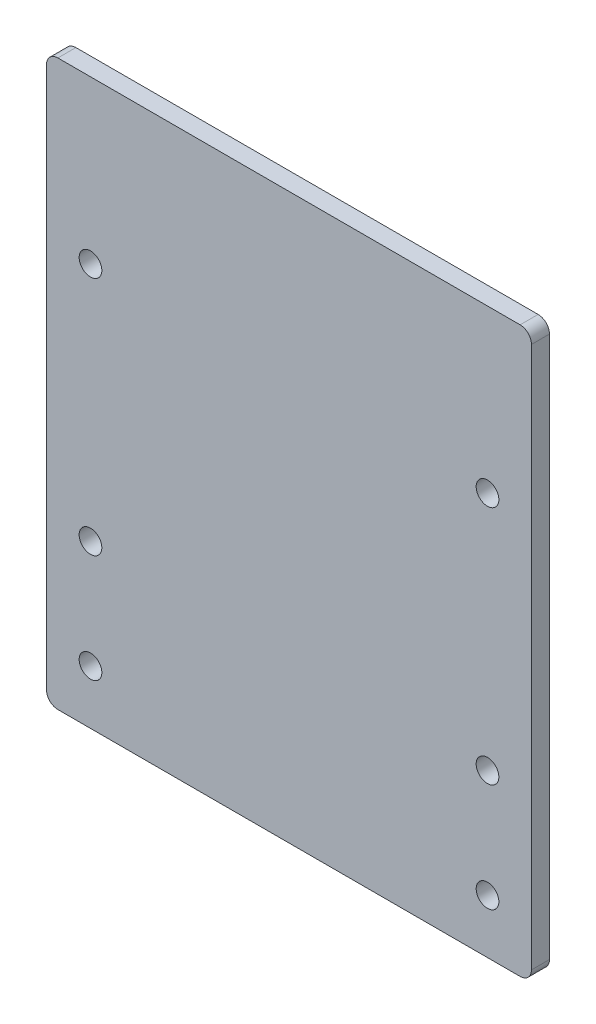
ISO-10303-21;
HEADER;
FILE_DESCRIPTION(('STEP AP214'),'2;1');
FILE_NAME('part.step','',(''),(''),'','','');
FILE_SCHEMA(('AUTOMOTIVE_DESIGN { 1 0 10303 214 1 1 1 1 }'));
ENDSEC;
DATA;
#1=APPLICATION_CONTEXT('core data for automotive mechanical design processes');
#2=APPLICATION_PROTOCOL_DEFINITION('international standard','automotive_design',2000,#1);
#3=PRODUCT_CONTEXT('',#1,'mechanical');
#4=PRODUCT('Part','Part','',(#3));
#5=PRODUCT_RELATED_PRODUCT_CATEGORY('part','',(#4));
#6=PRODUCT_DEFINITION_FORMATION('','',#4);
#7=PRODUCT_DEFINITION_CONTEXT('part definition',#1,'design');
#8=PRODUCT_DEFINITION('design','',#6,#7);
#9=PRODUCT_DEFINITION_SHAPE('','',#8);
#10=(LENGTH_UNIT() NAMED_UNIT(*) SI_UNIT(.MILLI.,.METRE.));
#11=(NAMED_UNIT(*) PLANE_ANGLE_UNIT() SI_UNIT($,.RADIAN.));
#12=(NAMED_UNIT(*) SI_UNIT($,.STERADIAN.) SOLID_ANGLE_UNIT());
#13=UNCERTAINTY_MEASURE_WITH_UNIT(LENGTH_MEASURE(1.E-05),#10,'distance_accuracy_value','');
#14=(GEOMETRIC_REPRESENTATION_CONTEXT(3) GLOBAL_UNCERTAINTY_ASSIGNED_CONTEXT((#13)) GLOBAL_UNIT_ASSIGNED_CONTEXT((#10,
#11,#12)) REPRESENTATION_CONTEXT('',''));
#15=CARTESIAN_POINT('',(0.,0.,0.));
#16=DIRECTION('',(0.,0.,1.));
#17=DIRECTION('',(1.,0.,0.));
#18=AXIS2_PLACEMENT_3D('',#15,#16,#17);
#19=CARTESIAN_POINT('',(40.75,-97.5,3.175));
#20=DIRECTION('',(0.,0.,1.));
#21=DIRECTION('',(1.,0.,0.));
#22=AXIS2_PLACEMENT_3D('',#19,#20,#21);
#23=PLANE('',#22);
#24=CARTESIAN_POINT('',(-35.,-70.92,3.175));
#25=DIRECTION('',(0.,0.,1.));
#26=DIRECTION('',(1.,0.,0.));
#27=AXIS2_PLACEMENT_3D('',#24,#25,#26);
#28=CIRCLE('',#27,2.);
#29=CARTESIAN_POINT('',(-33.,-70.92,3.175));
#30=VERTEX_POINT('',#29);
#31=EDGE_CURVE('E200',#30,#30,#28,.T.);
#32=ORIENTED_EDGE('',*,*,#31,.F.);
#33=EDGE_LOOP('',(#32));
#34=FACE_BOUND('',#33,.T.);
#35=CARTESIAN_POINT('',(35.,-70.925,3.175));
#36=DIRECTION('',(0.,0.,1.));
#37=DIRECTION('',(1.,0.,0.));
#38=AXIS2_PLACEMENT_3D('',#35,#36,#37);
#39=CIRCLE('',#38,2.);
#40=CARTESIAN_POINT('',(37.,-70.925,3.175));
#41=VERTEX_POINT('',#40);
#42=EDGE_CURVE('E188',#41,#41,#39,.T.);
#43=ORIENTED_EDGE('',*,*,#42,.F.);
#44=EDGE_LOOP('',(#43));
#45=FACE_BOUND('',#44,.T.);
#46=CARTESIAN_POINT('',(35.,-89.975,3.175));
#47=DIRECTION('',(0.,0.,1.));
#48=DIRECTION('',(1.,0.,0.));
#49=AXIS2_PLACEMENT_3D('',#46,#47,#48);
#50=CIRCLE('',#49,2.);
#51=CARTESIAN_POINT('',(37.,-89.975,3.175));
#52=VERTEX_POINT('',#51);
#53=EDGE_CURVE('E134',#52,#52,#50,.T.);
#54=ORIENTED_EDGE('',*,*,#53,.F.);
#55=EDGE_LOOP('',(#54));
#56=FACE_BOUND('',#55,.T.);
#57=CARTESIAN_POINT('',(40.75,-97.5,3.175));
#58=DIRECTION('',(0.,0.,1.));
#59=DIRECTION('',(1.,0.,0.));
#60=AXIS2_PLACEMENT_3D('',#57,#58,#59);
#61=CIRCLE('',#60,1.99999999999999);
#62=CARTESIAN_POINT('',(40.75,-99.5,3.175));
#63=VERTEX_POINT('',#62);
#64=CARTESIAN_POINT('',(42.75,-97.5,3.175));
#65=VERTEX_POINT('',#64);
#66=EDGE_CURVE('E145',#63,#65,#61,.T.);
#67=ORIENTED_EDGE('',*,*,#66,.T.);
#68=DIRECTION('',(0.,1.,0.));
#69=VECTOR('',#68,1.);
#70=CARTESIAN_POINT('',(42.75,-2.,3.175));
#71=LINE('',#70,#69);
#72=CARTESIAN_POINT('',(42.75,-2.,3.175));
#73=VERTEX_POINT('',#72);
#74=EDGE_CURVE('E93',#65,#73,#71,.T.);
#75=ORIENTED_EDGE('',*,*,#74,.T.);
#76=CARTESIAN_POINT('',(40.75,-2.,3.175));
#77=DIRECTION('',(0.,0.,1.));
#78=DIRECTION('',(-1.,0.,0.));
#79=AXIS2_PLACEMENT_3D('',#76,#77,#78);
#80=CIRCLE('',#79,2.);
#81=CARTESIAN_POINT('',(40.75,0.,3.175));
#82=VERTEX_POINT('',#81);
#83=EDGE_CURVE('E160',#73,#82,#80,.T.);
#84=ORIENTED_EDGE('',*,*,#83,.T.);
#85=DIRECTION('',(-1.,0.,0.));
#86=VECTOR('',#85,1.);
#87=CARTESIAN_POINT('',(-40.75,0.,3.175));
#88=LINE('',#87,#86);
#89=CARTESIAN_POINT('',(-40.75,0.,3.175));
#90=VERTEX_POINT('',#89);
#91=EDGE_CURVE('E173',#82,#90,#88,.T.);
#92=ORIENTED_EDGE('',*,*,#91,.T.);
#93=CARTESIAN_POINT('',(-40.75,-2.,3.175));
#94=DIRECTION('',(0.,0.,1.));
#95=DIRECTION('',(1.,0.,0.));
#96=AXIS2_PLACEMENT_3D('',#93,#94,#95);
#97=CIRCLE('',#96,2.);
#98=CARTESIAN_POINT('',(-42.75,-2.,3.175));
#99=VERTEX_POINT('',#98);
#100=EDGE_CURVE('E112',#90,#99,#97,.T.);
#101=ORIENTED_EDGE('',*,*,#100,.T.);
#102=DIRECTION('',(0.,-1.,0.));
#103=VECTOR('',#102,1.);
#104=CARTESIAN_POINT('',(-42.75,-2.,3.175));
#105=LINE('',#104,#103);
#106=CARTESIAN_POINT('',(-42.75,-97.5,3.175));
#107=VERTEX_POINT('',#106);
#108=EDGE_CURVE('E106',#99,#107,#105,.T.);
#109=ORIENTED_EDGE('',*,*,#108,.T.);
#110=CARTESIAN_POINT('',(-40.75,-97.5,3.175));
#111=DIRECTION('',(0.,0.,1.));
#112=DIRECTION('',(1.,0.,0.));
#113=AXIS2_PLACEMENT_3D('',#110,#111,#112);
#114=CIRCLE('',#113,1.99999999999999);
#115=CARTESIAN_POINT('',(-40.75,-99.5,3.175));
#116=VERTEX_POINT('',#115);
#117=EDGE_CURVE('E110',#107,#116,#114,.T.);
#118=ORIENTED_EDGE('',*,*,#117,.T.);
#119=DIRECTION('',(1.,0.,0.));
#120=VECTOR('',#119,1.);
#121=CARTESIAN_POINT('',(-40.75,-99.5,3.175));
#122=LINE('',#121,#120);
#123=EDGE_CURVE('E50',#116,#63,#122,.T.);
#124=ORIENTED_EDGE('',*,*,#123,.T.);
#125=EDGE_LOOP('',(#67,#75,#84,#92,#101,#109,#118,#124));
#126=FACE_BOUND('',#125,.T.);
#127=CARTESIAN_POINT('',(-35.,-89.975,3.175));
#128=DIRECTION('',(0.,0.,1.));
#129=DIRECTION('',(1.,0.,0.));
#130=AXIS2_PLACEMENT_3D('',#127,#128,#129);
#131=CIRCLE('',#130,2.);
#132=CARTESIAN_POINT('',(-33.,-89.975,3.175));
#133=VERTEX_POINT('',#132);
#134=EDGE_CURVE('E182',#133,#133,#131,.T.);
#135=ORIENTED_EDGE('',*,*,#134,.F.);
#136=EDGE_LOOP('',(#135));
#137=FACE_BOUND('',#136,.T.);
#138=CARTESIAN_POINT('',(35.,-28.58,3.175));
#139=DIRECTION('',(0.,0.,1.));
#140=DIRECTION('',(1.,0.,0.));
#141=AXIS2_PLACEMENT_3D('',#138,#139,#140);
#142=CIRCLE('',#141,2.);
#143=CARTESIAN_POINT('',(37.,-28.58,3.175));
#144=VERTEX_POINT('',#143);
#145=EDGE_CURVE('E194',#144,#144,#142,.T.);
#146=ORIENTED_EDGE('',*,*,#145,.F.);
#147=EDGE_LOOP('',(#146));
#148=FACE_BOUND('',#147,.T.);
#149=CARTESIAN_POINT('',(-35.,-28.58,3.175));
#150=DIRECTION('',(0.,0.,1.));
#151=DIRECTION('',(1.,0.,0.));
#152=AXIS2_PLACEMENT_3D('',#149,#150,#151);
#153=CIRCLE('',#152,2.);
#154=CARTESIAN_POINT('',(-33.,-28.58,3.175));
#155=VERTEX_POINT('',#154);
#156=EDGE_CURVE('E206',#155,#155,#153,.T.);
#157=ORIENTED_EDGE('',*,*,#156,.F.);
#158=EDGE_LOOP('',(#157));
#159=FACE_BOUND('',#158,.T.);
#160=ADVANCED_FACE('F33',(#34,#45,#56,#126,#137,#148,#159),#23,.T.);
#161=CARTESIAN_POINT('',(40.75,-97.5,0.));
#162=DIRECTION('',(0.,0.,1.));
#163=DIRECTION('',(1.,0.,0.));
#164=AXIS2_PLACEMENT_3D('',#161,#162,#163);
#165=PLANE('',#164);
#166=CARTESIAN_POINT('',(40.75,-97.5,0.));
#167=DIRECTION('',(0.,0.,1.));
#168=DIRECTION('',(1.,0.,0.));
#169=AXIS2_PLACEMENT_3D('',#166,#167,#168);
#170=CIRCLE('',#169,1.99999999999999);
#171=CARTESIAN_POINT('',(40.75,-99.5,0.));
#172=VERTEX_POINT('',#171);
#173=CARTESIAN_POINT('',(42.75,-97.5,0.));
#174=VERTEX_POINT('',#173);
#175=EDGE_CURVE('E130',#172,#174,#170,.T.);
#176=ORIENTED_EDGE('',*,*,#175,.F.);
#177=DIRECTION('',(1.,0.,0.));
#178=VECTOR('',#177,1.);
#179=CARTESIAN_POINT('',(-40.75,-99.5,0.));
#180=LINE('',#179,#178);
#181=CARTESIAN_POINT('',(-40.75,-99.5,0.));
#182=VERTEX_POINT('',#181);
#183=EDGE_CURVE('E85',#182,#172,#180,.T.);
#184=ORIENTED_EDGE('',*,*,#183,.F.);
#185=CARTESIAN_POINT('',(-40.75,-97.5,0.));
#186=DIRECTION('',(0.,0.,1.));
#187=DIRECTION('',(1.,0.,0.));
#188=AXIS2_PLACEMENT_3D('',#185,#186,#187);
#189=CIRCLE('',#188,1.99999999999999);
#190=CARTESIAN_POINT('',(-42.75,-97.5,0.));
#191=VERTEX_POINT('',#190);
#192=EDGE_CURVE('E79',#191,#182,#189,.T.);
#193=ORIENTED_EDGE('',*,*,#192,.F.);
#194=DIRECTION('',(0.,-1.,0.));
#195=VECTOR('',#194,1.);
#196=CARTESIAN_POINT('',(-42.75,-2.,0.));
#197=LINE('',#196,#195);
#198=CARTESIAN_POINT('',(-42.75,-2.,0.));
#199=VERTEX_POINT('',#198);
#200=EDGE_CURVE('E120',#199,#191,#197,.T.);
#201=ORIENTED_EDGE('',*,*,#200,.F.);
#202=CARTESIAN_POINT('',(-40.75,-2.,0.));
#203=DIRECTION('',(0.,0.,1.));
#204=DIRECTION('',(1.,0.,0.));
#205=AXIS2_PLACEMENT_3D('',#202,#203,#204);
#206=CIRCLE('',#205,2.);
#207=CARTESIAN_POINT('',(-40.75,0.,0.));
#208=VERTEX_POINT('',#207);
#209=EDGE_CURVE('E140',#208,#199,#206,.T.);
#210=ORIENTED_EDGE('',*,*,#209,.F.);
#211=DIRECTION('',(-1.,0.,0.));
#212=VECTOR('',#211,1.);
#213=CARTESIAN_POINT('',(-40.75,0.,0.));
#214=LINE('',#213,#212);
#215=CARTESIAN_POINT('',(40.75,0.,0.));
#216=VERTEX_POINT('',#215);
#217=EDGE_CURVE('E138',#216,#208,#214,.T.);
#218=ORIENTED_EDGE('',*,*,#217,.F.);
#219=CARTESIAN_POINT('',(40.75,-2.,0.));
#220=DIRECTION('',(0.,0.,1.));
#221=DIRECTION('',(-1.,0.,0.));
#222=AXIS2_PLACEMENT_3D('',#219,#220,#221);
#223=CIRCLE('',#222,2.);
#224=CARTESIAN_POINT('',(42.75,-2.,0.));
#225=VERTEX_POINT('',#224);
#226=EDGE_CURVE('E136',#225,#216,#223,.T.);
#227=ORIENTED_EDGE('',*,*,#226,.F.);
#228=DIRECTION('',(0.,1.,0.));
#229=VECTOR('',#228,1.);
#230=CARTESIAN_POINT('',(42.75,-2.,0.));
#231=LINE('',#230,#229);
#232=EDGE_CURVE('E133',#174,#225,#231,.T.);
#233=ORIENTED_EDGE('',*,*,#232,.F.);
#234=EDGE_LOOP('',(#176,#184,#193,#201,#210,#218,#227,#233));
#235=FACE_BOUND('',#234,.T.);
#236=CARTESIAN_POINT('',(35.,-89.975,0.));
#237=DIRECTION('',(0.,0.,1.));
#238=DIRECTION('',(1.,0.,0.));
#239=AXIS2_PLACEMENT_3D('',#236,#237,#238);
#240=CIRCLE('',#239,2.);
#241=CARTESIAN_POINT('',(37.,-89.975,0.));
#242=VERTEX_POINT('',#241);
#243=EDGE_CURVE('E179',#242,#242,#240,.T.);
#244=ORIENTED_EDGE('',*,*,#243,.T.);
#245=EDGE_LOOP('',(#244));
#246=FACE_BOUND('',#245,.T.);
#247=CARTESIAN_POINT('',(-35.,-89.975,0.));
#248=DIRECTION('',(0.,0.,1.));
#249=DIRECTION('',(1.,0.,0.));
#250=AXIS2_PLACEMENT_3D('',#247,#248,#249);
#251=CIRCLE('',#250,2.);
#252=CARTESIAN_POINT('',(-33.,-89.975,0.));
#253=VERTEX_POINT('',#252);
#254=EDGE_CURVE('E185',#253,#253,#251,.T.);
#255=ORIENTED_EDGE('',*,*,#254,.T.);
#256=EDGE_LOOP('',(#255));
#257=FACE_BOUND('',#256,.T.);
#258=CARTESIAN_POINT('',(35.,-70.925,0.));
#259=DIRECTION('',(0.,0.,1.));
#260=DIRECTION('',(1.,0.,0.));
#261=AXIS2_PLACEMENT_3D('',#258,#259,#260);
#262=CIRCLE('',#261,2.);
#263=CARTESIAN_POINT('',(37.,-70.925,0.));
#264=VERTEX_POINT('',#263);
#265=EDGE_CURVE('E191',#264,#264,#262,.T.);
#266=ORIENTED_EDGE('',*,*,#265,.T.);
#267=EDGE_LOOP('',(#266));
#268=FACE_BOUND('',#267,.T.);
#269=CARTESIAN_POINT('',(35.,-28.58,0.));
#270=DIRECTION('',(0.,0.,1.));
#271=DIRECTION('',(1.,0.,0.));
#272=AXIS2_PLACEMENT_3D('',#269,#270,#271);
#273=CIRCLE('',#272,2.);
#274=CARTESIAN_POINT('',(37.,-28.58,0.));
#275=VERTEX_POINT('',#274);
#276=EDGE_CURVE('E197',#275,#275,#273,.T.);
#277=ORIENTED_EDGE('',*,*,#276,.T.);
#278=EDGE_LOOP('',(#277));
#279=FACE_BOUND('',#278,.T.);
#280=CARTESIAN_POINT('',(-35.,-70.92,0.));
#281=DIRECTION('',(0.,0.,1.));
#282=DIRECTION('',(1.,0.,0.));
#283=AXIS2_PLACEMENT_3D('',#280,#281,#282);
#284=CIRCLE('',#283,2.);
#285=CARTESIAN_POINT('',(-33.,-70.92,0.));
#286=VERTEX_POINT('',#285);
#287=EDGE_CURVE('E203',#286,#286,#284,.T.);
#288=ORIENTED_EDGE('',*,*,#287,.T.);
#289=EDGE_LOOP('',(#288));
#290=FACE_BOUND('',#289,.T.);
#291=CARTESIAN_POINT('',(-35.,-28.58,0.));
#292=DIRECTION('',(0.,0.,1.));
#293=DIRECTION('',(1.,0.,0.));
#294=AXIS2_PLACEMENT_3D('',#291,#292,#293);
#295=CIRCLE('',#294,2.);
#296=CARTESIAN_POINT('',(-33.,-28.58,0.));
#297=VERTEX_POINT('',#296);
#298=EDGE_CURVE('E209',#297,#297,#295,.T.);
#299=ORIENTED_EDGE('',*,*,#298,.T.);
#300=EDGE_LOOP('',(#299));
#301=FACE_BOUND('',#300,.T.);
#302=ADVANCED_FACE('F164',(#235,#246,#257,#268,#279,#290,#301),#165,.F.);
#303=CARTESIAN_POINT('',(40.75,-97.5,3.175));
#304=DIRECTION('',(0.,0.,-1.));
#305=DIRECTION('',(-1.,0.,0.));
#306=AXIS2_PLACEMENT_3D('',#303,#304,#305);
#307=CYLINDRICAL_SURFACE('',#306,1.99999999999999);
#308=ORIENTED_EDGE('',*,*,#175,.T.);
#309=DIRECTION('',(0.,0.,-1.));
#310=VECTOR('',#309,1.);
#311=CARTESIAN_POINT('',(42.75,-97.5,3.175));
#312=LINE('',#311,#310);
#313=EDGE_CURVE('E11',#65,#174,#312,.T.);
#314=ORIENTED_EDGE('',*,*,#313,.F.);
#315=ORIENTED_EDGE('',*,*,#66,.F.);
#316=DIRECTION('',(0.,0.,-1.));
#317=VECTOR('',#316,1.);
#318=CARTESIAN_POINT('',(40.75,-99.5,3.175));
#319=LINE('',#318,#317);
#320=EDGE_CURVE('E126',#63,#172,#319,.T.);
#321=ORIENTED_EDGE('',*,*,#320,.T.);
#322=EDGE_LOOP('',(#308,#314,#315,#321));
#323=FACE_BOUND('',#322,.T.);
#324=ADVANCED_FACE('F35',(#323),#307,.T.);
#325=CARTESIAN_POINT('',(42.75,-2.,3.175));
#326=DIRECTION('',(-1.,0.,0.));
#327=DIRECTION('',(0.,-1.,0.));
#328=AXIS2_PLACEMENT_3D('',#325,#326,#327);
#329=PLANE('',#328);
#330=ORIENTED_EDGE('',*,*,#232,.T.);
#331=DIRECTION('',(0.,0.,-1.));
#332=VECTOR('',#331,1.);
#333=CARTESIAN_POINT('',(42.75,-2.,3.175));
#334=LINE('',#333,#332);
#335=EDGE_CURVE('E42',#73,#225,#334,.T.);
#336=ORIENTED_EDGE('',*,*,#335,.F.);
#337=ORIENTED_EDGE('',*,*,#74,.F.);
#338=ORIENTED_EDGE('',*,*,#313,.T.);
#339=EDGE_LOOP('',(#330,#336,#337,#338));
#340=FACE_BOUND('',#339,.T.);
#341=ADVANCED_FACE('F243',(#340),#329,.F.);
#342=CARTESIAN_POINT('',(40.75,-2.,3.175));
#343=DIRECTION('',(0.,0.,-1.));
#344=DIRECTION('',(-1.,0.,0.));
#345=AXIS2_PLACEMENT_3D('',#342,#343,#344);
#346=CYLINDRICAL_SURFACE('',#345,2.);
#347=ORIENTED_EDGE('',*,*,#226,.T.);
#348=DIRECTION('',(0.,0.,-1.));
#349=VECTOR('',#348,1.);
#350=CARTESIAN_POINT('',(40.75,0.,3.175));
#351=LINE('',#350,#349);
#352=EDGE_CURVE('E152',#82,#216,#351,.T.);
#353=ORIENTED_EDGE('',*,*,#352,.F.);
#354=ORIENTED_EDGE('',*,*,#83,.F.);
#355=ORIENTED_EDGE('',*,*,#335,.T.);
#356=EDGE_LOOP('',(#347,#353,#354,#355));
#357=FACE_BOUND('',#356,.T.);
#358=ADVANCED_FACE('F158',(#357),#346,.T.);
#359=CARTESIAN_POINT('',(-40.75,0.,3.175));
#360=DIRECTION('',(0.,-1.,0.));
#361=DIRECTION('',(0.,0.,-1.));
#362=AXIS2_PLACEMENT_3D('',#359,#360,#361);
#363=PLANE('',#362);
#364=ORIENTED_EDGE('',*,*,#217,.T.);
#365=DIRECTION('',(0.,0.,-1.));
#366=VECTOR('',#365,1.);
#367=CARTESIAN_POINT('',(-40.75,0.,3.175));
#368=LINE('',#367,#366);
#369=EDGE_CURVE('E149',#90,#208,#368,.T.);
#370=ORIENTED_EDGE('',*,*,#369,.F.);
#371=ORIENTED_EDGE('',*,*,#91,.F.);
#372=ORIENTED_EDGE('',*,*,#352,.T.);
#373=EDGE_LOOP('',(#364,#370,#371,#372));
#374=FACE_BOUND('',#373,.T.);
#375=ADVANCED_FACE('F169',(#374),#363,.F.);
#376=CARTESIAN_POINT('',(-40.75,-2.,3.175));
#377=DIRECTION('',(0.,0.,-1.));
#378=DIRECTION('',(-1.,0.,0.));
#379=AXIS2_PLACEMENT_3D('',#376,#377,#378);
#380=CYLINDRICAL_SURFACE('',#379,2.);
#381=ORIENTED_EDGE('',*,*,#209,.T.);
#382=DIRECTION('',(0.,0.,-1.));
#383=VECTOR('',#382,1.);
#384=CARTESIAN_POINT('',(-42.75,-2.,3.175));
#385=LINE('',#384,#383);
#386=EDGE_CURVE('E121',#99,#199,#385,.T.);
#387=ORIENTED_EDGE('',*,*,#386,.F.);
#388=ORIENTED_EDGE('',*,*,#100,.F.);
#389=ORIENTED_EDGE('',*,*,#369,.T.);
#390=EDGE_LOOP('',(#381,#387,#388,#389));
#391=FACE_BOUND('',#390,.T.);
#392=ADVANCED_FACE('F172',(#391),#380,.T.);
#393=CARTESIAN_POINT('',(-42.75,-2.,3.175));
#394=DIRECTION('',(1.,0.,0.));
#395=DIRECTION('',(0.,1.,0.));
#396=AXIS2_PLACEMENT_3D('',#393,#394,#395);
#397=PLANE('',#396);
#398=ORIENTED_EDGE('',*,*,#200,.T.);
#399=DIRECTION('',(0.,0.,-1.));
#400=VECTOR('',#399,1.);
#401=CARTESIAN_POINT('',(-42.75,-97.5,3.175));
#402=LINE('',#401,#400);
#403=EDGE_CURVE('E117',#107,#191,#402,.T.);
#404=ORIENTED_EDGE('',*,*,#403,.F.);
#405=ORIENTED_EDGE('',*,*,#108,.F.);
#406=ORIENTED_EDGE('',*,*,#386,.T.);
#407=EDGE_LOOP('',(#398,#404,#405,#406));
#408=FACE_BOUND('',#407,.T.);
#409=ADVANCED_FACE('F118',(#408),#397,.F.);
#410=CARTESIAN_POINT('',(-40.75,-97.5,3.175));
#411=DIRECTION('',(0.,0.,-1.));
#412=DIRECTION('',(-1.,0.,0.));
#413=AXIS2_PLACEMENT_3D('',#410,#411,#412);
#414=CYLINDRICAL_SURFACE('',#413,1.99999999999999);
#415=ORIENTED_EDGE('',*,*,#192,.T.);
#416=DIRECTION('',(0.,0.,-1.));
#417=VECTOR('',#416,1.);
#418=CARTESIAN_POINT('',(-40.75,-99.5,3.175));
#419=LINE('',#418,#417);
#420=EDGE_CURVE('E122',#116,#182,#419,.T.);
#421=ORIENTED_EDGE('',*,*,#420,.F.);
#422=ORIENTED_EDGE('',*,*,#117,.F.);
#423=ORIENTED_EDGE('',*,*,#403,.T.);
#424=EDGE_LOOP('',(#415,#421,#422,#423));
#425=FACE_BOUND('',#424,.T.);
#426=ADVANCED_FACE('F124',(#425),#414,.T.);
#427=CARTESIAN_POINT('',(-40.75,-99.5,3.175));
#428=DIRECTION('',(0.,1.,0.));
#429=DIRECTION('',(0.,0.,1.));
#430=AXIS2_PLACEMENT_3D('',#427,#428,#429);
#431=PLANE('',#430);
#432=ORIENTED_EDGE('',*,*,#183,.T.);
#433=ORIENTED_EDGE('',*,*,#320,.F.);
#434=ORIENTED_EDGE('',*,*,#123,.F.);
#435=ORIENTED_EDGE('',*,*,#420,.T.);
#436=EDGE_LOOP('',(#432,#433,#434,#435));
#437=FACE_BOUND('',#436,.T.);
#438=ADVANCED_FACE('F231',(#437),#431,.F.);
#439=CARTESIAN_POINT('',(35.,-89.975,3.175));
#440=DIRECTION('',(0.,0.,-1.));
#441=DIRECTION('',(-1.,0.,0.));
#442=AXIS2_PLACEMENT_3D('',#439,#440,#441);
#443=CYLINDRICAL_SURFACE('',#442,2.);
#444=ORIENTED_EDGE('',*,*,#53,.T.);
#445=EDGE_LOOP('',(#444));
#446=FACE_BOUND('',#445,.T.);
#447=ORIENTED_EDGE('',*,*,#243,.F.);
#448=EDGE_LOOP('',(#447));
#449=FACE_BOUND('',#448,.T.);
#450=ADVANCED_FACE('F228',(#446,#449),#443,.F.);
#451=CARTESIAN_POINT('',(-35.,-89.975,3.175));
#452=DIRECTION('',(0.,0.,-1.));
#453=DIRECTION('',(-1.,0.,0.));
#454=AXIS2_PLACEMENT_3D('',#451,#452,#453);
#455=CYLINDRICAL_SURFACE('',#454,2.);
#456=ORIENTED_EDGE('',*,*,#134,.T.);
#457=EDGE_LOOP('',(#456));
#458=FACE_BOUND('',#457,.T.);
#459=ORIENTED_EDGE('',*,*,#254,.F.);
#460=EDGE_LOOP('',(#459));
#461=FACE_BOUND('',#460,.T.);
#462=ADVANCED_FACE('F307',(#458,#461),#455,.F.);
#463=CARTESIAN_POINT('',(35.,-70.925,3.175));
#464=DIRECTION('',(0.,0.,-1.));
#465=DIRECTION('',(-1.,0.,0.));
#466=AXIS2_PLACEMENT_3D('',#463,#464,#465);
#467=CYLINDRICAL_SURFACE('',#466,2.);
#468=ORIENTED_EDGE('',*,*,#42,.T.);
#469=EDGE_LOOP('',(#468));
#470=FACE_BOUND('',#469,.T.);
#471=ORIENTED_EDGE('',*,*,#265,.F.);
#472=EDGE_LOOP('',(#471));
#473=FACE_BOUND('',#472,.T.);
#474=ADVANCED_FACE('F315',(#470,#473),#467,.F.);
#475=CARTESIAN_POINT('',(35.,-28.58,3.175));
#476=DIRECTION('',(0.,0.,-1.));
#477=DIRECTION('',(-1.,0.,0.));
#478=AXIS2_PLACEMENT_3D('',#475,#476,#477);
#479=CYLINDRICAL_SURFACE('',#478,2.);
#480=ORIENTED_EDGE('',*,*,#145,.T.);
#481=EDGE_LOOP('',(#480));
#482=FACE_BOUND('',#481,.T.);
#483=ORIENTED_EDGE('',*,*,#276,.F.);
#484=EDGE_LOOP('',(#483));
#485=FACE_BOUND('',#484,.T.);
#486=ADVANCED_FACE('F323',(#482,#485),#479,.F.);
#487=CARTESIAN_POINT('',(-35.,-70.92,3.175));
#488=DIRECTION('',(0.,0.,-1.));
#489=DIRECTION('',(-1.,0.,0.));
#490=AXIS2_PLACEMENT_3D('',#487,#488,#489);
#491=CYLINDRICAL_SURFACE('',#490,2.);
#492=ORIENTED_EDGE('',*,*,#31,.T.);
#493=EDGE_LOOP('',(#492));
#494=FACE_BOUND('',#493,.T.);
#495=ORIENTED_EDGE('',*,*,#287,.F.);
#496=EDGE_LOOP('',(#495));
#497=FACE_BOUND('',#496,.T.);
#498=ADVANCED_FACE('F332',(#494,#497),#491,.F.);
#499=CARTESIAN_POINT('',(-35.,-28.58,3.175));
#500=DIRECTION('',(0.,0.,-1.));
#501=DIRECTION('',(-1.,0.,0.));
#502=AXIS2_PLACEMENT_3D('',#499,#500,#501);
#503=CYLINDRICAL_SURFACE('',#502,2.);
#504=ORIENTED_EDGE('',*,*,#156,.T.);
#505=EDGE_LOOP('',(#504));
#506=FACE_BOUND('',#505,.T.);
#507=ORIENTED_EDGE('',*,*,#298,.F.);
#508=EDGE_LOOP('',(#507));
#509=FACE_BOUND('',#508,.T.);
#510=ADVANCED_FACE('F215',(#506,#509),#503,.F.);
#511=CLOSED_SHELL('',(#160,#302,#324,#341,#358,#375,#392,#409,#426,#438,#450,#462,#474,#486,
#498,#510));
#512=MANIFOLD_SOLID_BREP('B2',#511);
#513=ADVANCED_BREP_SHAPE_REPRESENTATION('',(#18,#512),#14);
#514=SHAPE_DEFINITION_REPRESENTATION(#9,#513);
ENDSEC;
END-ISO-10303-21;
